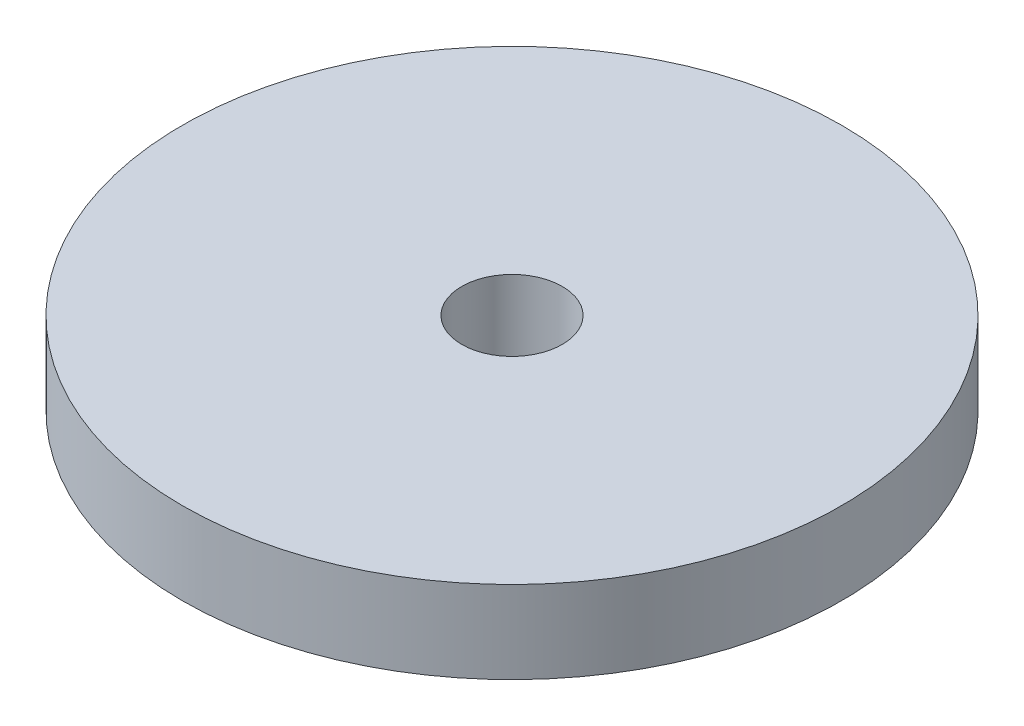
ISO-10303-21;
HEADER;
FILE_DESCRIPTION(('STEP AP214'),'2;1');
FILE_NAME('part.step','',(''),(''),'','','');
FILE_SCHEMA(('AUTOMOTIVE_DESIGN { 1 0 10303 214 1 1 1 1 }'));
ENDSEC;
DATA;
#1=APPLICATION_CONTEXT('core data for automotive mechanical design processes');
#2=APPLICATION_PROTOCOL_DEFINITION('international standard','automotive_design',2000,#1);
#3=PRODUCT_CONTEXT('',#1,'mechanical');
#4=PRODUCT('Part','Part','',(#3));
#5=PRODUCT_RELATED_PRODUCT_CATEGORY('part','',(#4));
#6=PRODUCT_DEFINITION_FORMATION('','',#4);
#7=PRODUCT_DEFINITION_CONTEXT('part definition',#1,'design');
#8=PRODUCT_DEFINITION('design','',#6,#7);
#9=PRODUCT_DEFINITION_SHAPE('','',#8);
#10=(LENGTH_UNIT() NAMED_UNIT(*) SI_UNIT(.MILLI.,.METRE.));
#11=(NAMED_UNIT(*) PLANE_ANGLE_UNIT() SI_UNIT($,.RADIAN.));
#12=(NAMED_UNIT(*) SI_UNIT($,.STERADIAN.) SOLID_ANGLE_UNIT());
#13=UNCERTAINTY_MEASURE_WITH_UNIT(LENGTH_MEASURE(1.E-05),#10,'distance_accuracy_value','');
#14=(GEOMETRIC_REPRESENTATION_CONTEXT(3) GLOBAL_UNCERTAINTY_ASSIGNED_CONTEXT((#13)) GLOBAL_UNIT_ASSIGNED_CONTEXT((#10,
#11,#12)) REPRESENTATION_CONTEXT('',''));
#15=CARTESIAN_POINT('',(0.,0.,0.));
#16=DIRECTION('',(0.,0.,1.));
#17=DIRECTION('',(1.,0.,0.));
#18=AXIS2_PLACEMENT_3D('',#15,#16,#17);
#19=CARTESIAN_POINT('',(0.,10.,0.));
#20=DIRECTION('',(0.,1.,0.));
#21=DIRECTION('',(0.,0.,1.));
#22=AXIS2_PLACEMENT_3D('',#19,#20,#21);
#23=PLANE('',#22);
#24=CARTESIAN_POINT('',(0.,10.,0.));
#25=DIRECTION('',(0.,1.,0.));
#26=DIRECTION('',(0.,0.,1.));
#27=AXIS2_PLACEMENT_3D('',#24,#25,#26);
#28=CIRCLE('',#27,40.);
#29=CARTESIAN_POINT('',(0.,10.,40.));
#30=VERTEX_POINT('',#29);
#31=EDGE_CURVE('E10',#30,#30,#28,.T.);
#32=ORIENTED_EDGE('',*,*,#31,.T.);
#33=EDGE_LOOP('',(#32));
#34=FACE_BOUND('',#33,.T.);
#35=CARTESIAN_POINT('',(0.,10.,0.));
#36=DIRECTION('',(0.,1.,0.));
#37=DIRECTION('',(0.,0.,1.));
#38=AXIS2_PLACEMENT_3D('',#35,#36,#37);
#39=CIRCLE('',#38,6.1);
#40=CARTESIAN_POINT('',(0.,10.,6.1));
#41=VERTEX_POINT('',#40);
#42=EDGE_CURVE('E45',#41,#41,#39,.T.);
#43=ORIENTED_EDGE('',*,*,#42,.F.);
#44=EDGE_LOOP('',(#43));
#45=FACE_BOUND('',#44,.T.);
#46=ADVANCED_FACE('F34',(#34,#45),#23,.T.);
#47=CARTESIAN_POINT('',(0.,0.,0.));
#48=DIRECTION('',(0.,1.,0.));
#49=DIRECTION('',(0.,0.,1.));
#50=AXIS2_PLACEMENT_3D('',#47,#48,#49);
#51=PLANE('',#50);
#52=CARTESIAN_POINT('',(0.,0.,0.));
#53=DIRECTION('',(0.,1.,0.));
#54=DIRECTION('',(0.,0.,1.));
#55=AXIS2_PLACEMENT_3D('',#52,#53,#54);
#56=CIRCLE('',#55,40.);
#57=CARTESIAN_POINT('',(0.,0.,40.));
#58=VERTEX_POINT('',#57);
#59=EDGE_CURVE('E38',#58,#58,#56,.T.);
#60=ORIENTED_EDGE('',*,*,#59,.F.);
#61=EDGE_LOOP('',(#60));
#62=FACE_BOUND('',#61,.T.);
#63=CARTESIAN_POINT('',(0.,0.,0.));
#64=DIRECTION('',(0.,1.,0.));
#65=DIRECTION('',(0.,0.,1.));
#66=AXIS2_PLACEMENT_3D('',#63,#64,#65);
#67=CIRCLE('',#66,6.1);
#68=CARTESIAN_POINT('',(0.,0.,6.1));
#69=VERTEX_POINT('',#68);
#70=EDGE_CURVE('E47',#69,#69,#67,.T.);
#71=ORIENTED_EDGE('',*,*,#70,.T.);
#72=EDGE_LOOP('',(#71));
#73=FACE_BOUND('',#72,.T.);
#74=ADVANCED_FACE('F57',(#62,#73),#51,.F.);
#75=CARTESIAN_POINT('',(0.,10.,0.));
#76=DIRECTION('',(0.,-1.,0.));
#77=DIRECTION('',(0.,0.,-1.));
#78=AXIS2_PLACEMENT_3D('',#75,#76,#77);
#79=CYLINDRICAL_SURFACE('',#78,40.);
#80=ORIENTED_EDGE('',*,*,#31,.F.);
#81=EDGE_LOOP('',(#80));
#82=FACE_BOUND('',#81,.T.);
#83=ORIENTED_EDGE('',*,*,#59,.T.);
#84=EDGE_LOOP('',(#83));
#85=FACE_BOUND('',#84,.T.);
#86=ADVANCED_FACE('F36',(#82,#85),#79,.T.);
#87=CARTESIAN_POINT('',(0.,10.,0.));
#88=DIRECTION('',(0.,-1.,0.));
#89=DIRECTION('',(0.,0.,-1.));
#90=AXIS2_PLACEMENT_3D('',#87,#88,#89);
#91=CYLINDRICAL_SURFACE('',#90,6.1);
#92=ORIENTED_EDGE('',*,*,#42,.T.);
#93=EDGE_LOOP('',(#92));
#94=FACE_BOUND('',#93,.T.);
#95=ORIENTED_EDGE('',*,*,#70,.F.);
#96=EDGE_LOOP('',(#95));
#97=FACE_BOUND('',#96,.T.);
#98=ADVANCED_FACE('F53',(#94,#97),#91,.F.);
#99=CLOSED_SHELL('',(#46,#74,#86,#98));
#100=MANIFOLD_SOLID_BREP('B2',#99);
#101=ADVANCED_BREP_SHAPE_REPRESENTATION('',(#18,#100),#14);
#102=SHAPE_DEFINITION_REPRESENTATION(#9,#101);
ENDSEC;
END-ISO-10303-21;
